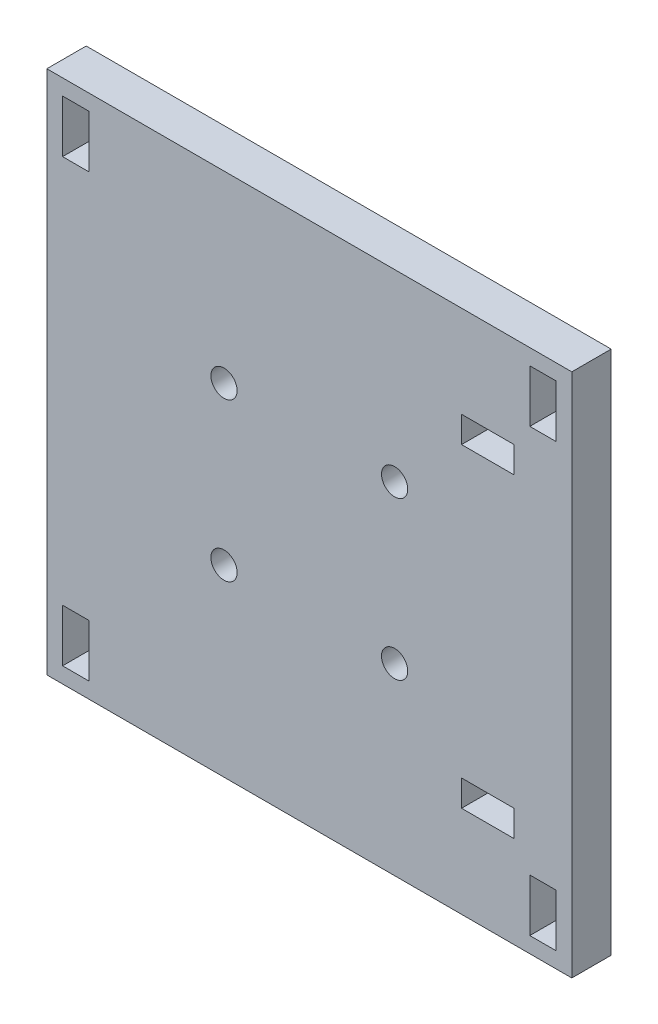
ISO-10303-21;
HEADER;
FILE_DESCRIPTION(('STEP AP214'),'2;1');
FILE_NAME('part.step','',(''),(''),'','','');
FILE_SCHEMA(('AUTOMOTIVE_DESIGN { 1 0 10303 214 1 1 1 1 }'));
ENDSEC;
DATA;
#1=APPLICATION_CONTEXT('core data for automotive mechanical design processes');
#2=APPLICATION_PROTOCOL_DEFINITION('international standard','automotive_design',2000,#1);
#3=PRODUCT_CONTEXT('',#1,'mechanical');
#4=PRODUCT('Part','Part','',(#3));
#5=PRODUCT_RELATED_PRODUCT_CATEGORY('part','',(#4));
#6=PRODUCT_DEFINITION_FORMATION('','',#4);
#7=PRODUCT_DEFINITION_CONTEXT('part definition',#1,'design');
#8=PRODUCT_DEFINITION('design','',#6,#7);
#9=PRODUCT_DEFINITION_SHAPE('','',#8);
#10=(LENGTH_UNIT() NAMED_UNIT(*) SI_UNIT(.MILLI.,.METRE.));
#11=(NAMED_UNIT(*) PLANE_ANGLE_UNIT() SI_UNIT($,.RADIAN.));
#12=(NAMED_UNIT(*) SI_UNIT($,.STERADIAN.) SOLID_ANGLE_UNIT());
#13=UNCERTAINTY_MEASURE_WITH_UNIT(LENGTH_MEASURE(1.E-05),#10,'distance_accuracy_value','');
#14=(GEOMETRIC_REPRESENTATION_CONTEXT(3) GLOBAL_UNCERTAINTY_ASSIGNED_CONTEXT((#13)) GLOBAL_UNIT_ASSIGNED_CONTEXT((#10,
#11,#12)) REPRESENTATION_CONTEXT('',''));
#15=CARTESIAN_POINT('',(0.,0.,0.));
#16=DIRECTION('',(0.,0.,1.));
#17=DIRECTION('',(1.,0.,0.));
#18=AXIS2_PLACEMENT_3D('',#15,#16,#17);
#19=CARTESIAN_POINT('',(0.,0.,3.));
#20=DIRECTION('',(0.,0.,-1.));
#21=DIRECTION('',(-1.,0.,0.));
#22=AXIS2_PLACEMENT_3D('',#19,#20,#21);
#23=PLANE('',#22);
#24=DIRECTION('',(-1.,0.,0.));
#25=VECTOR('',#24,1.);
#26=CARTESIAN_POINT('',(18.8,18.8,3.));
#27=LINE('',#26,#25);
#28=CARTESIAN_POINT('',(18.8,18.8,3.));
#29=VERTEX_POINT('',#28);
#30=CARTESIAN_POINT('',(16.8,18.8,3.));
#31=VERTEX_POINT('',#30);
#32=EDGE_CURVE('E279',#29,#31,#27,.T.);
#33=ORIENTED_EDGE('',*,*,#32,.F.);
#34=DIRECTION('',(0.,1.,0.));
#35=VECTOR('',#34,1.);
#36=CARTESIAN_POINT('',(18.8,18.8,3.));
#37=LINE('',#36,#35);
#38=CARTESIAN_POINT('',(18.8,14.8,3.));
#39=VERTEX_POINT('',#38);
#40=EDGE_CURVE('E52',#39,#29,#37,.T.);
#41=ORIENTED_EDGE('',*,*,#40,.F.);
#42=DIRECTION('',(1.,0.,0.));
#43=VECTOR('',#42,1.);
#44=CARTESIAN_POINT('',(18.8,14.8,3.));
#45=LINE('',#44,#43);
#46=CARTESIAN_POINT('',(16.8,14.8,3.));
#47=VERTEX_POINT('',#46);
#48=EDGE_CURVE('E272',#47,#39,#45,.T.);
#49=ORIENTED_EDGE('',*,*,#48,.F.);
#50=DIRECTION('',(0.,-1.,0.));
#51=VECTOR('',#50,1.);
#52=CARTESIAN_POINT('',(16.8,18.8,3.));
#53=LINE('',#52,#51);
#54=EDGE_CURVE('E275',#31,#47,#53,.T.);
#55=ORIENTED_EDGE('',*,*,#54,.F.);
#56=EDGE_LOOP('',(#33,#41,#49,#55));
#57=FACE_BOUND('',#56,.T.);
#58=DIRECTION('',(0.,1.,0.));
#59=VECTOR('',#58,1.);
#60=CARTESIAN_POINT('',(18.8,-18.8,3.));
#61=LINE('',#60,#59);
#62=CARTESIAN_POINT('',(18.8,-18.8,3.));
#63=VERTEX_POINT('',#62);
#64=CARTESIAN_POINT('',(18.8,-14.8,3.));
#65=VERTEX_POINT('',#64);
#66=EDGE_CURVE('E311',#63,#65,#61,.T.);
#67=ORIENTED_EDGE('',*,*,#66,.F.);
#68=DIRECTION('',(1.,0.,0.));
#69=VECTOR('',#68,1.);
#70=CARTESIAN_POINT('',(18.8,-18.8,3.));
#71=LINE('',#70,#69);
#72=CARTESIAN_POINT('',(16.8,-18.8,3.));
#73=VERTEX_POINT('',#72);
#74=EDGE_CURVE('E60',#73,#63,#71,.T.);
#75=ORIENTED_EDGE('',*,*,#74,.F.);
#76=DIRECTION('',(0.,-1.,0.));
#77=VECTOR('',#76,1.);
#78=CARTESIAN_POINT('',(16.8,-18.8,3.));
#79=LINE('',#78,#77);
#80=CARTESIAN_POINT('',(16.8,-14.8,3.));
#81=VERTEX_POINT('',#80);
#82=EDGE_CURVE('E304',#81,#73,#79,.T.);
#83=ORIENTED_EDGE('',*,*,#82,.F.);
#84=DIRECTION('',(-1.,0.,0.));
#85=VECTOR('',#84,1.);
#86=CARTESIAN_POINT('',(18.8,-14.8,3.));
#87=LINE('',#86,#85);
#88=EDGE_CURVE('E307',#65,#81,#87,.T.);
#89=ORIENTED_EDGE('',*,*,#88,.F.);
#90=EDGE_LOOP('',(#67,#75,#83,#89));
#91=FACE_BOUND('',#90,.T.);
#92=DIRECTION('',(1.,0.,0.));
#93=VECTOR('',#92,1.);
#94=CARTESIAN_POINT('',(-18.8,-18.8,3.));
#95=LINE('',#94,#93);
#96=CARTESIAN_POINT('',(-18.8,-18.8,3.));
#97=VERTEX_POINT('',#96);
#98=CARTESIAN_POINT('',(-16.8,-18.8,3.));
#99=VERTEX_POINT('',#98);
#100=EDGE_CURVE('E343',#97,#99,#95,.T.);
#101=ORIENTED_EDGE('',*,*,#100,.F.);
#102=DIRECTION('',(0.,-1.,0.));
#103=VECTOR('',#102,1.);
#104=CARTESIAN_POINT('',(-18.8,-18.8,3.));
#105=LINE('',#104,#103);
#106=CARTESIAN_POINT('',(-18.8,-14.8,3.));
#107=VERTEX_POINT('',#106);
#108=EDGE_CURVE('E303',#107,#97,#105,.T.);
#109=ORIENTED_EDGE('',*,*,#108,.F.);
#110=DIRECTION('',(-1.,0.,0.));
#111=VECTOR('',#110,1.);
#112=CARTESIAN_POINT('',(-18.8,-14.8,3.));
#113=LINE('',#112,#111);
#114=CARTESIAN_POINT('',(-16.8,-14.8,3.));
#115=VERTEX_POINT('',#114);
#116=EDGE_CURVE('E336',#115,#107,#113,.T.);
#117=ORIENTED_EDGE('',*,*,#116,.F.);
#118=DIRECTION('',(0.,1.,0.));
#119=VECTOR('',#118,1.);
#120=CARTESIAN_POINT('',(-16.8,-18.8,3.));
#121=LINE('',#120,#119);
#122=EDGE_CURVE('E339',#99,#115,#121,.T.);
#123=ORIENTED_EDGE('',*,*,#122,.F.);
#124=EDGE_LOOP('',(#101,#109,#117,#123));
#125=FACE_BOUND('',#124,.T.);
#126=DIRECTION('',(1.,0.,0.));
#127=VECTOR('',#126,1.);
#128=CARTESIAN_POINT('',(11.6,11.,3.));
#129=LINE('',#128,#127);
#130=CARTESIAN_POINT('',(11.6,11.,3.));
#131=VERTEX_POINT('',#130);
#132=CARTESIAN_POINT('',(15.6,11.,3.));
#133=VERTEX_POINT('',#132);
#134=EDGE_CURVE('E371',#131,#133,#129,.T.);
#135=ORIENTED_EDGE('',*,*,#134,.F.);
#136=DIRECTION('',(0.,-1.,0.));
#137=VECTOR('',#136,1.);
#138=CARTESIAN_POINT('',(11.6,13.,3.));
#139=LINE('',#138,#137);
#140=CARTESIAN_POINT('',(11.6,13.,3.));
#141=VERTEX_POINT('',#140);
#142=EDGE_CURVE('E335',#141,#131,#139,.T.);
#143=ORIENTED_EDGE('',*,*,#142,.F.);
#144=DIRECTION('',(-1.,0.,0.));
#145=VECTOR('',#144,1.);
#146=CARTESIAN_POINT('',(11.6,13.,3.));
#147=LINE('',#146,#145);
#148=CARTESIAN_POINT('',(15.6,13.,3.));
#149=VERTEX_POINT('',#148);
#150=EDGE_CURVE('E364',#149,#141,#147,.T.);
#151=ORIENTED_EDGE('',*,*,#150,.F.);
#152=DIRECTION('',(0.,1.,0.));
#153=VECTOR('',#152,1.);
#154=CARTESIAN_POINT('',(15.6,13.,3.));
#155=LINE('',#154,#153);
#156=EDGE_CURVE('E367',#133,#149,#155,.T.);
#157=ORIENTED_EDGE('',*,*,#156,.F.);
#158=EDGE_LOOP('',(#135,#143,#151,#157));
#159=FACE_BOUND('',#158,.T.);
#160=DIRECTION('',(0.,1.,0.));
#161=VECTOR('',#160,1.);
#162=CARTESIAN_POINT('',(15.6,-13.,3.));
#163=LINE('',#162,#161);
#164=CARTESIAN_POINT('',(15.6,-13.,3.));
#165=VERTEX_POINT('',#164);
#166=CARTESIAN_POINT('',(15.6,-11.,3.));
#167=VERTEX_POINT('',#166);
#168=EDGE_CURVE('E245',#165,#167,#163,.T.);
#169=ORIENTED_EDGE('',*,*,#168,.F.);
#170=DIRECTION('',(1.,0.,0.));
#171=VECTOR('',#170,1.);
#172=CARTESIAN_POINT('',(11.6,-13.,3.));
#173=LINE('',#172,#171);
#174=CARTESIAN_POINT('',(11.6,-13.,3.));
#175=VERTEX_POINT('',#174);
#176=EDGE_CURVE('E225',#175,#165,#173,.T.);
#177=ORIENTED_EDGE('',*,*,#176,.F.);
#178=DIRECTION('',(0.,-1.,0.));
#179=VECTOR('',#178,1.);
#180=CARTESIAN_POINT('',(11.6,-13.,3.));
#181=LINE('',#180,#179);
#182=CARTESIAN_POINT('',(11.6,-11.,3.));
#183=VERTEX_POINT('',#182);
#184=EDGE_CURVE('E235',#183,#175,#181,.T.);
#185=ORIENTED_EDGE('',*,*,#184,.F.);
#186=DIRECTION('',(-1.,0.,0.));
#187=VECTOR('',#186,1.);
#188=CARTESIAN_POINT('',(11.6,-11.,3.));
#189=LINE('',#188,#187);
#190=EDGE_CURVE('E240',#167,#183,#189,.T.);
#191=ORIENTED_EDGE('',*,*,#190,.F.);
#192=EDGE_LOOP('',(#169,#177,#185,#191));
#193=FACE_BOUND('',#192,.T.);
#194=DIRECTION('',(1.,0.,0.));
#195=VECTOR('',#194,1.);
#196=CARTESIAN_POINT('',(-18.8,14.8,3.));
#197=LINE('',#196,#195);
#198=CARTESIAN_POINT('',(-18.8,14.8,3.));
#199=VERTEX_POINT('',#198);
#200=CARTESIAN_POINT('',(-16.8,14.8,3.));
#201=VERTEX_POINT('',#200);
#202=EDGE_CURVE('E400',#199,#201,#197,.T.);
#203=ORIENTED_EDGE('',*,*,#202,.F.);
#204=DIRECTION('',(0.,-1.,0.));
#205=VECTOR('',#204,1.);
#206=CARTESIAN_POINT('',(-18.8,18.8,3.));
#207=LINE('',#206,#205);
#208=CARTESIAN_POINT('',(-18.8,18.8,3.));
#209=VERTEX_POINT('',#208);
#210=EDGE_CURVE('E283',#209,#199,#207,.T.);
#211=ORIENTED_EDGE('',*,*,#210,.F.);
#212=DIRECTION('',(-1.,0.,0.));
#213=VECTOR('',#212,1.);
#214=CARTESIAN_POINT('',(-18.8,18.8,3.));
#215=LINE('',#214,#213);
#216=CARTESIAN_POINT('',(-16.8,18.8,3.));
#217=VERTEX_POINT('',#216);
#218=EDGE_CURVE('E389',#217,#209,#215,.T.);
#219=ORIENTED_EDGE('',*,*,#218,.F.);
#220=DIRECTION('',(0.,1.,0.));
#221=VECTOR('',#220,1.);
#222=CARTESIAN_POINT('',(-16.8,18.8,3.));
#223=LINE('',#222,#221);
#224=EDGE_CURVE('E403',#201,#217,#223,.T.);
#225=ORIENTED_EDGE('',*,*,#224,.F.);
#226=EDGE_LOOP('',(#203,#211,#219,#225));
#227=FACE_BOUND('',#226,.T.);
#228=DIRECTION('',(0.,1.,0.));
#229=VECTOR('',#228,1.);
#230=CARTESIAN_POINT('',(20.,-20.,3.));
#231=LINE('',#230,#229);
#232=CARTESIAN_POINT('',(20.,-20.,3.));
#233=VERTEX_POINT('',#232);
#234=CARTESIAN_POINT('',(20.,20.,3.));
#235=VERTEX_POINT('',#234);
#236=EDGE_CURVE('E441',#233,#235,#231,.T.);
#237=ORIENTED_EDGE('',*,*,#236,.T.);
#238=DIRECTION('',(-1.,0.,0.));
#239=VECTOR('',#238,1.);
#240=CARTESIAN_POINT('',(-20.,20.,3.));
#241=LINE('',#240,#239);
#242=CARTESIAN_POINT('',(-20.,20.,3.));
#243=VERTEX_POINT('',#242);
#244=EDGE_CURVE('E444',#235,#243,#241,.T.);
#245=ORIENTED_EDGE('',*,*,#244,.T.);
#246=DIRECTION('',(0.,-1.,0.));
#247=VECTOR('',#246,1.);
#248=CARTESIAN_POINT('',(-20.,-20.,3.));
#249=LINE('',#248,#247);
#250=CARTESIAN_POINT('',(-20.,-20.,3.));
#251=VERTEX_POINT('',#250);
#252=EDGE_CURVE('E447',#243,#251,#249,.T.);
#253=ORIENTED_EDGE('',*,*,#252,.T.);
#254=DIRECTION('',(1.,0.,0.));
#255=VECTOR('',#254,1.);
#256=CARTESIAN_POINT('',(-20.,-20.,3.));
#257=LINE('',#256,#255);
#258=EDGE_CURVE('E449',#251,#233,#257,.T.);
#259=ORIENTED_EDGE('',*,*,#258,.T.);
#260=EDGE_LOOP('',(#237,#245,#253,#259));
#261=FACE_BOUND('',#260,.T.);
#262=CARTESIAN_POINT('',(6.5,-6.,3.));
#263=DIRECTION('',(0.,0.,1.));
#264=DIRECTION('',(1.,0.,0.));
#265=AXIS2_PLACEMENT_3D('',#262,#263,#264);
#266=CIRCLE('',#265,1.);
#267=CARTESIAN_POINT('',(7.5,-6.,3.));
#268=VERTEX_POINT('',#267);
#269=EDGE_CURVE('E435',#268,#268,#266,.T.);
#270=ORIENTED_EDGE('',*,*,#269,.F.);
#271=EDGE_LOOP('',(#270));
#272=FACE_BOUND('',#271,.T.);
#273=CARTESIAN_POINT('',(-6.49999999999996,-6.,3.));
#274=DIRECTION('',(0.,0.,1.));
#275=DIRECTION('',(-1.,0.,0.));
#276=AXIS2_PLACEMENT_3D('',#273,#274,#275);
#277=CIRCLE('',#276,1.);
#278=CARTESIAN_POINT('',(-7.49999999999996,-6.,3.));
#279=VERTEX_POINT('',#278);
#280=EDGE_CURVE('E429',#279,#279,#277,.T.);
#281=ORIENTED_EDGE('',*,*,#280,.F.);
#282=EDGE_LOOP('',(#281));
#283=FACE_BOUND('',#282,.T.);
#284=CARTESIAN_POINT('',(6.5,6.,3.));
#285=DIRECTION('',(0.,0.,1.));
#286=DIRECTION('',(-1.,0.,0.));
#287=AXIS2_PLACEMENT_3D('',#284,#285,#286);
#288=CIRCLE('',#287,1.);
#289=CARTESIAN_POINT('',(5.5,6.,3.));
#290=VERTEX_POINT('',#289);
#291=EDGE_CURVE('E423',#290,#290,#288,.T.);
#292=ORIENTED_EDGE('',*,*,#291,.F.);
#293=EDGE_LOOP('',(#292));
#294=FACE_BOUND('',#293,.T.);
#295=CARTESIAN_POINT('',(-6.49999999999996,6.,3.));
#296=DIRECTION('',(0.,0.,1.));
#297=DIRECTION('',(1.,0.,0.));
#298=AXIS2_PLACEMENT_3D('',#295,#296,#297);
#299=CIRCLE('',#298,1.);
#300=CARTESIAN_POINT('',(-5.49999999999996,6.,3.));
#301=VERTEX_POINT('',#300);
#302=EDGE_CURVE('E417',#301,#301,#299,.T.);
#303=ORIENTED_EDGE('',*,*,#302,.F.);
#304=EDGE_LOOP('',(#303));
#305=FACE_BOUND('',#304,.T.);
#306=ADVANCED_FACE('F37',(#57,#91,#125,#159,#193,#227,#261,#272,#283,#294,#305),#23,.F.);
#307=CARTESIAN_POINT('',(0.,0.,0.));
#308=DIRECTION('',(0.,0.,-1.));
#309=DIRECTION('',(-1.,0.,0.));
#310=AXIS2_PLACEMENT_3D('',#307,#308,#309);
#311=PLANE('',#310);
#312=DIRECTION('',(0.,1.,0.));
#313=VECTOR('',#312,1.);
#314=CARTESIAN_POINT('',(18.8,18.8,0.));
#315=LINE('',#314,#313);
#316=CARTESIAN_POINT('',(18.8,14.8,0.));
#317=VERTEX_POINT('',#316);
#318=CARTESIAN_POINT('',(18.8,18.8,0.));
#319=VERTEX_POINT('',#318);
#320=EDGE_CURVE('E276',#317,#319,#315,.T.);
#321=ORIENTED_EDGE('',*,*,#320,.T.);
#322=DIRECTION('',(-1.,0.,0.));
#323=VECTOR('',#322,1.);
#324=CARTESIAN_POINT('',(18.8,18.8,0.));
#325=LINE('',#324,#323);
#326=CARTESIAN_POINT('',(16.8,18.8,0.));
#327=VERTEX_POINT('',#326);
#328=EDGE_CURVE('E289',#319,#327,#325,.T.);
#329=ORIENTED_EDGE('',*,*,#328,.T.);
#330=DIRECTION('',(0.,-1.,0.));
#331=VECTOR('',#330,1.);
#332=CARTESIAN_POINT('',(16.8,18.8,0.));
#333=LINE('',#332,#331);
#334=CARTESIAN_POINT('',(16.8,14.8,0.));
#335=VERTEX_POINT('',#334);
#336=EDGE_CURVE('E286',#327,#335,#333,.T.);
#337=ORIENTED_EDGE('',*,*,#336,.T.);
#338=DIRECTION('',(1.,0.,0.));
#339=VECTOR('',#338,1.);
#340=CARTESIAN_POINT('',(18.8,14.8,0.));
#341=LINE('',#340,#339);
#342=EDGE_CURVE('E265',#335,#317,#341,.T.);
#343=ORIENTED_EDGE('',*,*,#342,.T.);
#344=EDGE_LOOP('',(#321,#329,#337,#343));
#345=FACE_BOUND('',#344,.T.);
#346=DIRECTION('',(1.,0.,0.));
#347=VECTOR('',#346,1.);
#348=CARTESIAN_POINT('',(18.8,-18.8,0.));
#349=LINE('',#348,#347);
#350=CARTESIAN_POINT('',(16.8,-18.8,0.));
#351=VERTEX_POINT('',#350);
#352=CARTESIAN_POINT('',(18.8,-18.8,0.));
#353=VERTEX_POINT('',#352);
#354=EDGE_CURVE('E308',#351,#353,#349,.T.);
#355=ORIENTED_EDGE('',*,*,#354,.T.);
#356=DIRECTION('',(0.,1.,0.));
#357=VECTOR('',#356,1.);
#358=CARTESIAN_POINT('',(18.8,-18.8,0.));
#359=LINE('',#358,#357);
#360=CARTESIAN_POINT('',(18.8,-14.8,0.));
#361=VERTEX_POINT('',#360);
#362=EDGE_CURVE('E320',#353,#361,#359,.T.);
#363=ORIENTED_EDGE('',*,*,#362,.T.);
#364=DIRECTION('',(-1.,0.,0.));
#365=VECTOR('',#364,1.);
#366=CARTESIAN_POINT('',(18.8,-14.8,0.));
#367=LINE('',#366,#365);
#368=CARTESIAN_POINT('',(16.8,-14.8,0.));
#369=VERTEX_POINT('',#368);
#370=EDGE_CURVE('E317',#361,#369,#367,.T.);
#371=ORIENTED_EDGE('',*,*,#370,.T.);
#372=DIRECTION('',(0.,-1.,0.));
#373=VECTOR('',#372,1.);
#374=CARTESIAN_POINT('',(16.8,-18.8,0.));
#375=LINE('',#374,#373);
#376=EDGE_CURVE('E296',#369,#351,#375,.T.);
#377=ORIENTED_EDGE('',*,*,#376,.T.);
#378=EDGE_LOOP('',(#355,#363,#371,#377));
#379=FACE_BOUND('',#378,.T.);
#380=DIRECTION('',(0.,-1.,0.));
#381=VECTOR('',#380,1.);
#382=CARTESIAN_POINT('',(-18.8,-18.8,0.));
#383=LINE('',#382,#381);
#384=CARTESIAN_POINT('',(-18.8,-14.8,0.));
#385=VERTEX_POINT('',#384);
#386=CARTESIAN_POINT('',(-18.8,-18.8,0.));
#387=VERTEX_POINT('',#386);
#388=EDGE_CURVE('E340',#385,#387,#383,.T.);
#389=ORIENTED_EDGE('',*,*,#388,.T.);
#390=DIRECTION('',(1.,0.,0.));
#391=VECTOR('',#390,1.);
#392=CARTESIAN_POINT('',(-18.8,-18.8,0.));
#393=LINE('',#392,#391);
#394=CARTESIAN_POINT('',(-16.8,-18.8,0.));
#395=VERTEX_POINT('',#394);
#396=EDGE_CURVE('E352',#387,#395,#393,.T.);
#397=ORIENTED_EDGE('',*,*,#396,.T.);
#398=DIRECTION('',(0.,1.,0.));
#399=VECTOR('',#398,1.);
#400=CARTESIAN_POINT('',(-16.8,-18.8,0.));
#401=LINE('',#400,#399);
#402=CARTESIAN_POINT('',(-16.8,-14.8,0.));
#403=VERTEX_POINT('',#402);
#404=EDGE_CURVE('E349',#395,#403,#401,.T.);
#405=ORIENTED_EDGE('',*,*,#404,.T.);
#406=DIRECTION('',(-1.,0.,0.));
#407=VECTOR('',#406,1.);
#408=CARTESIAN_POINT('',(-18.8,-14.8,0.));
#409=LINE('',#408,#407);
#410=EDGE_CURVE('E328',#403,#385,#409,.T.);
#411=ORIENTED_EDGE('',*,*,#410,.T.);
#412=EDGE_LOOP('',(#389,#397,#405,#411));
#413=FACE_BOUND('',#412,.T.);
#414=DIRECTION('',(0.,-1.,0.));
#415=VECTOR('',#414,1.);
#416=CARTESIAN_POINT('',(11.6,13.,0.));
#417=LINE('',#416,#415);
#418=CARTESIAN_POINT('',(11.6,13.,0.));
#419=VERTEX_POINT('',#418);
#420=CARTESIAN_POINT('',(11.6,11.,0.));
#421=VERTEX_POINT('',#420);
#422=EDGE_CURVE('E368',#419,#421,#417,.T.);
#423=ORIENTED_EDGE('',*,*,#422,.T.);
#424=DIRECTION('',(1.,0.,0.));
#425=VECTOR('',#424,1.);
#426=CARTESIAN_POINT('',(11.6,11.,0.));
#427=LINE('',#426,#425);
#428=CARTESIAN_POINT('',(15.6,11.,0.));
#429=VERTEX_POINT('',#428);
#430=EDGE_CURVE('E380',#421,#429,#427,.T.);
#431=ORIENTED_EDGE('',*,*,#430,.T.);
#432=DIRECTION('',(0.,1.,0.));
#433=VECTOR('',#432,1.);
#434=CARTESIAN_POINT('',(15.6,13.,0.));
#435=LINE('',#434,#433);
#436=CARTESIAN_POINT('',(15.6,13.,0.));
#437=VERTEX_POINT('',#436);
#438=EDGE_CURVE('E377',#429,#437,#435,.T.);
#439=ORIENTED_EDGE('',*,*,#438,.T.);
#440=DIRECTION('',(-1.,0.,0.));
#441=VECTOR('',#440,1.);
#442=CARTESIAN_POINT('',(11.6,13.,0.));
#443=LINE('',#442,#441);
#444=EDGE_CURVE('E360',#437,#419,#443,.T.);
#445=ORIENTED_EDGE('',*,*,#444,.T.);
#446=EDGE_LOOP('',(#423,#431,#439,#445));
#447=FACE_BOUND('',#446,.T.);
#448=DIRECTION('',(1.,0.,0.));
#449=VECTOR('',#448,1.);
#450=CARTESIAN_POINT('',(11.6,-13.,0.));
#451=LINE('',#450,#449);
#452=CARTESIAN_POINT('',(11.6,-13.,0.));
#453=VERTEX_POINT('',#452);
#454=CARTESIAN_POINT('',(15.6,-13.,0.));
#455=VERTEX_POINT('',#454);
#456=EDGE_CURVE('E228',#453,#455,#451,.T.);
#457=ORIENTED_EDGE('',*,*,#456,.T.);
#458=DIRECTION('',(0.,1.,0.));
#459=VECTOR('',#458,1.);
#460=CARTESIAN_POINT('',(15.6,-13.,0.));
#461=LINE('',#460,#459);
#462=CARTESIAN_POINT('',(15.6,-11.,0.));
#463=VERTEX_POINT('',#462);
#464=EDGE_CURVE('E259',#455,#463,#461,.T.);
#465=ORIENTED_EDGE('',*,*,#464,.T.);
#466=DIRECTION('',(-1.,0.,0.));
#467=VECTOR('',#466,1.);
#468=CARTESIAN_POINT('',(11.6,-11.,0.));
#469=LINE('',#468,#467);
#470=CARTESIAN_POINT('',(11.6,-11.,0.));
#471=VERTEX_POINT('',#470);
#472=EDGE_CURVE('E255',#463,#471,#469,.T.);
#473=ORIENTED_EDGE('',*,*,#472,.T.);
#474=DIRECTION('',(0.,-1.,0.));
#475=VECTOR('',#474,1.);
#476=CARTESIAN_POINT('',(11.6,-13.,0.));
#477=LINE('',#476,#475);
#478=EDGE_CURVE('E253',#471,#453,#477,.T.);
#479=ORIENTED_EDGE('',*,*,#478,.T.);
#480=EDGE_LOOP('',(#457,#465,#473,#479));
#481=FACE_BOUND('',#480,.T.);
#482=DIRECTION('',(0.,-1.,0.));
#483=VECTOR('',#482,1.);
#484=CARTESIAN_POINT('',(-18.8,18.8,0.));
#485=LINE('',#484,#483);
#486=CARTESIAN_POINT('',(-18.8,18.8,0.));
#487=VERTEX_POINT('',#486);
#488=CARTESIAN_POINT('',(-18.8,14.8,0.));
#489=VERTEX_POINT('',#488);
#490=EDGE_CURVE('E385',#487,#489,#485,.T.);
#491=ORIENTED_EDGE('',*,*,#490,.T.);
#492=DIRECTION('',(1.,0.,0.));
#493=VECTOR('',#492,1.);
#494=CARTESIAN_POINT('',(-18.8,14.8,0.));
#495=LINE('',#494,#493);
#496=CARTESIAN_POINT('',(-16.8,14.8,0.));
#497=VERTEX_POINT('',#496);
#498=EDGE_CURVE('E388',#489,#497,#495,.T.);
#499=ORIENTED_EDGE('',*,*,#498,.T.);
#500=DIRECTION('',(0.,1.,0.));
#501=VECTOR('',#500,1.);
#502=CARTESIAN_POINT('',(-16.8,18.8,0.));
#503=LINE('',#502,#501);
#504=CARTESIAN_POINT('',(-16.8,18.8,0.));
#505=VERTEX_POINT('',#504);
#506=EDGE_CURVE('E392',#497,#505,#503,.T.);
#507=ORIENTED_EDGE('',*,*,#506,.T.);
#508=DIRECTION('',(-1.,0.,0.));
#509=VECTOR('',#508,1.);
#510=CARTESIAN_POINT('',(-18.8,18.8,0.));
#511=LINE('',#510,#509);
#512=EDGE_CURVE('E395',#505,#487,#511,.T.);
#513=ORIENTED_EDGE('',*,*,#512,.T.);
#514=EDGE_LOOP('',(#491,#499,#507,#513));
#515=FACE_BOUND('',#514,.T.);
#516=CARTESIAN_POINT('',(6.5,6.,0.));
#517=DIRECTION('',(0.,0.,1.));
#518=DIRECTION('',(-1.,0.,0.));
#519=AXIS2_PLACEMENT_3D('',#516,#517,#518);
#520=CIRCLE('',#519,1.);
#521=CARTESIAN_POINT('',(5.5,6.,0.));
#522=VERTEX_POINT('',#521);
#523=EDGE_CURVE('E420',#522,#522,#520,.T.);
#524=ORIENTED_EDGE('',*,*,#523,.T.);
#525=EDGE_LOOP('',(#524));
#526=FACE_BOUND('',#525,.T.);
#527=CARTESIAN_POINT('',(6.5,-6.,0.));
#528=DIRECTION('',(0.,0.,1.));
#529=DIRECTION('',(1.,0.,0.));
#530=AXIS2_PLACEMENT_3D('',#527,#528,#529);
#531=CIRCLE('',#530,1.);
#532=CARTESIAN_POINT('',(7.5,-6.,0.));
#533=VERTEX_POINT('',#532);
#534=EDGE_CURVE('E432',#533,#533,#531,.T.);
#535=ORIENTED_EDGE('',*,*,#534,.T.);
#536=EDGE_LOOP('',(#535));
#537=FACE_BOUND('',#536,.T.);
#538=DIRECTION('',(0.,1.,0.));
#539=VECTOR('',#538,1.);
#540=CARTESIAN_POINT('',(20.,-20.,0.));
#541=LINE('',#540,#539);
#542=CARTESIAN_POINT('',(20.,-20.,0.));
#543=VERTEX_POINT('',#542);
#544=CARTESIAN_POINT('',(20.,20.,0.));
#545=VERTEX_POINT('',#544);
#546=EDGE_CURVE('E438',#543,#545,#541,.T.);
#547=ORIENTED_EDGE('',*,*,#546,.F.);
#548=DIRECTION('',(1.,0.,0.));
#549=VECTOR('',#548,1.);
#550=CARTESIAN_POINT('',(-20.,-20.,0.));
#551=LINE('',#550,#549);
#552=CARTESIAN_POINT('',(-20.,-20.,0.));
#553=VERTEX_POINT('',#552);
#554=EDGE_CURVE('E445',#553,#543,#551,.T.);
#555=ORIENTED_EDGE('',*,*,#554,.F.);
#556=DIRECTION('',(0.,-1.,0.));
#557=VECTOR('',#556,1.);
#558=CARTESIAN_POINT('',(-20.,-20.,0.));
#559=LINE('',#558,#557);
#560=CARTESIAN_POINT('',(-20.,20.,0.));
#561=VERTEX_POINT('',#560);
#562=EDGE_CURVE('E456',#561,#553,#559,.T.);
#563=ORIENTED_EDGE('',*,*,#562,.F.);
#564=DIRECTION('',(-1.,0.,0.));
#565=VECTOR('',#564,1.);
#566=CARTESIAN_POINT('',(-20.,20.,0.));
#567=LINE('',#566,#565);
#568=EDGE_CURVE('E454',#545,#561,#567,.T.);
#569=ORIENTED_EDGE('',*,*,#568,.F.);
#570=EDGE_LOOP('',(#547,#555,#563,#569));
#571=FACE_BOUND('',#570,.T.);
#572=CARTESIAN_POINT('',(-6.49999999999996,-6.,0.));
#573=DIRECTION('',(0.,0.,1.));
#574=DIRECTION('',(-1.,0.,0.));
#575=AXIS2_PLACEMENT_3D('',#572,#573,#574);
#576=CIRCLE('',#575,1.);
#577=CARTESIAN_POINT('',(-7.49999999999996,-6.,0.));
#578=VERTEX_POINT('',#577);
#579=EDGE_CURVE('E426',#578,#578,#576,.T.);
#580=ORIENTED_EDGE('',*,*,#579,.T.);
#581=EDGE_LOOP('',(#580));
#582=FACE_BOUND('',#581,.T.);
#583=CARTESIAN_POINT('',(-6.49999999999996,6.,0.));
#584=DIRECTION('',(0.,0.,1.));
#585=DIRECTION('',(1.,0.,0.));
#586=AXIS2_PLACEMENT_3D('',#583,#584,#585);
#587=CIRCLE('',#586,1.);
#588=CARTESIAN_POINT('',(-5.49999999999996,6.,0.));
#589=VERTEX_POINT('',#588);
#590=EDGE_CURVE('E410',#589,#589,#587,.T.);
#591=ORIENTED_EDGE('',*,*,#590,.T.);
#592=EDGE_LOOP('',(#591));
#593=FACE_BOUND('',#592,.T.);
#594=ADVANCED_FACE('F474',(#345,#379,#413,#447,#481,#515,#526,#537,#571,#582,#593),#311,.T.);
#595=CARTESIAN_POINT('',(20.,-20.,3.));
#596=DIRECTION('',(-1.,0.,0.));
#597=DIRECTION('',(0.,0.,1.));
#598=AXIS2_PLACEMENT_3D('',#595,#596,#597);
#599=PLANE('',#598);
#600=ORIENTED_EDGE('',*,*,#546,.T.);
#601=DIRECTION('',(0.,0.,-1.));
#602=VECTOR('',#601,1.);
#603=CARTESIAN_POINT('',(20.,20.,3.));
#604=LINE('',#603,#602);
#605=EDGE_CURVE('E11',#235,#545,#604,.T.);
#606=ORIENTED_EDGE('',*,*,#605,.F.);
#607=ORIENTED_EDGE('',*,*,#236,.F.);
#608=DIRECTION('',(0.,0.,-1.));
#609=VECTOR('',#608,1.);
#610=CARTESIAN_POINT('',(20.,-20.,3.));
#611=LINE('',#610,#609);
#612=EDGE_CURVE('E451',#233,#543,#611,.T.);
#613=ORIENTED_EDGE('',*,*,#612,.T.);
#614=EDGE_LOOP('',(#600,#606,#607,#613));
#615=FACE_BOUND('',#614,.T.);
#616=ADVANCED_FACE('F39',(#615),#599,.F.);
#617=CARTESIAN_POINT('',(-20.,20.,3.));
#618=DIRECTION('',(0.,-1.,0.));
#619=DIRECTION('',(0.,0.,-1.));
#620=AXIS2_PLACEMENT_3D('',#617,#618,#619);
#621=PLANE('',#620);
#622=ORIENTED_EDGE('',*,*,#568,.T.);
#623=DIRECTION('',(0.,0.,-1.));
#624=VECTOR('',#623,1.);
#625=CARTESIAN_POINT('',(-20.,20.,3.));
#626=LINE('',#625,#624);
#627=EDGE_CURVE('E45',#243,#561,#626,.T.);
#628=ORIENTED_EDGE('',*,*,#627,.F.);
#629=ORIENTED_EDGE('',*,*,#244,.F.);
#630=ORIENTED_EDGE('',*,*,#605,.T.);
#631=EDGE_LOOP('',(#622,#628,#629,#630));
#632=FACE_BOUND('',#631,.T.);
#633=ADVANCED_FACE('F485',(#632),#621,.F.);
#634=CARTESIAN_POINT('',(-20.,-20.,3.));
#635=DIRECTION('',(1.,0.,0.));
#636=DIRECTION('',(0.,0.,-1.));
#637=AXIS2_PLACEMENT_3D('',#634,#635,#636);
#638=PLANE('',#637);
#639=ORIENTED_EDGE('',*,*,#562,.T.);
#640=DIRECTION('',(0.,0.,-1.));
#641=VECTOR('',#640,1.);
#642=CARTESIAN_POINT('',(-20.,-20.,3.));
#643=LINE('',#642,#641);
#644=EDGE_CURVE('E461',#251,#553,#643,.T.);
#645=ORIENTED_EDGE('',*,*,#644,.F.);
#646=ORIENTED_EDGE('',*,*,#252,.F.);
#647=ORIENTED_EDGE('',*,*,#627,.T.);
#648=EDGE_LOOP('',(#639,#645,#646,#647));
#649=FACE_BOUND('',#648,.T.);
#650=ADVANCED_FACE('F468',(#649),#638,.F.);
#651=CARTESIAN_POINT('',(-20.,-20.,3.));
#652=DIRECTION('',(0.,1.,0.));
#653=DIRECTION('',(0.,0.,1.));
#654=AXIS2_PLACEMENT_3D('',#651,#652,#653);
#655=PLANE('',#654);
#656=ORIENTED_EDGE('',*,*,#554,.T.);
#657=ORIENTED_EDGE('',*,*,#612,.F.);
#658=ORIENTED_EDGE('',*,*,#258,.F.);
#659=ORIENTED_EDGE('',*,*,#644,.T.);
#660=EDGE_LOOP('',(#656,#657,#658,#659));
#661=FACE_BOUND('',#660,.T.);
#662=ADVANCED_FACE('F478',(#661),#655,.F.);
#663=CARTESIAN_POINT('',(6.5,-6.,3.));
#664=DIRECTION('',(0.,0.,-1.));
#665=DIRECTION('',(-1.,0.,0.));
#666=AXIS2_PLACEMENT_3D('',#663,#664,#665);
#667=CYLINDRICAL_SURFACE('',#666,1.);
#668=ORIENTED_EDGE('',*,*,#269,.T.);
#669=EDGE_LOOP('',(#668));
#670=FACE_BOUND('',#669,.T.);
#671=ORIENTED_EDGE('',*,*,#534,.F.);
#672=EDGE_LOOP('',(#671));
#673=FACE_BOUND('',#672,.T.);
#674=ADVANCED_FACE('F504',(#670,#673),#667,.F.);
#675=CARTESIAN_POINT('',(-6.49999999999996,-6.,3.));
#676=DIRECTION('',(0.,0.,-1.));
#677=DIRECTION('',(-1.,0.,0.));
#678=AXIS2_PLACEMENT_3D('',#675,#676,#677);
#679=CYLINDRICAL_SURFACE('',#678,1.);
#680=ORIENTED_EDGE('',*,*,#280,.T.);
#681=EDGE_LOOP('',(#680));
#682=FACE_BOUND('',#681,.T.);
#683=ORIENTED_EDGE('',*,*,#579,.F.);
#684=EDGE_LOOP('',(#683));
#685=FACE_BOUND('',#684,.T.);
#686=ADVANCED_FACE('F511',(#682,#685),#679,.F.);
#687=CARTESIAN_POINT('',(6.5,6.,3.));
#688=DIRECTION('',(0.,0.,-1.));
#689=DIRECTION('',(-1.,0.,0.));
#690=AXIS2_PLACEMENT_3D('',#687,#688,#689);
#691=CYLINDRICAL_SURFACE('',#690,1.);
#692=ORIENTED_EDGE('',*,*,#291,.T.);
#693=EDGE_LOOP('',(#692));
#694=FACE_BOUND('',#693,.T.);
#695=ORIENTED_EDGE('',*,*,#523,.F.);
#696=EDGE_LOOP('',(#695));
#697=FACE_BOUND('',#696,.T.);
#698=ADVANCED_FACE('F516',(#694,#697),#691,.F.);
#699=CARTESIAN_POINT('',(-6.49999999999996,6.,3.));
#700=DIRECTION('',(0.,0.,-1.));
#701=DIRECTION('',(-1.,0.,0.));
#702=AXIS2_PLACEMENT_3D('',#699,#700,#701);
#703=CYLINDRICAL_SURFACE('',#702,1.);
#704=ORIENTED_EDGE('',*,*,#302,.T.);
#705=EDGE_LOOP('',(#704));
#706=FACE_BOUND('',#705,.T.);
#707=ORIENTED_EDGE('',*,*,#590,.F.);
#708=EDGE_LOOP('',(#707));
#709=FACE_BOUND('',#708,.T.);
#710=ADVANCED_FACE('F529',(#706,#709),#703,.F.);
#711=CARTESIAN_POINT('',(-18.8,18.8,0.));
#712=DIRECTION('',(-1.,0.,0.));
#713=DIRECTION('',(0.,0.,1.));
#714=AXIS2_PLACEMENT_3D('',#711,#712,#713);
#715=PLANE('',#714);
#716=ORIENTED_EDGE('',*,*,#210,.T.);
#717=DIRECTION('',(0.,0.,1.));
#718=VECTOR('',#717,1.);
#719=CARTESIAN_POINT('',(-18.8,14.8,0.));
#720=LINE('',#719,#718);
#721=EDGE_CURVE('E398',#489,#199,#720,.T.);
#722=ORIENTED_EDGE('',*,*,#721,.F.);
#723=ORIENTED_EDGE('',*,*,#490,.F.);
#724=DIRECTION('',(0.,0.,1.));
#725=VECTOR('',#724,1.);
#726=CARTESIAN_POINT('',(-18.8,18.8,0.));
#727=LINE('',#726,#725);
#728=EDGE_CURVE('E408',#487,#209,#727,.T.);
#729=ORIENTED_EDGE('',*,*,#728,.T.);
#730=EDGE_LOOP('',(#716,#722,#723,#729));
#731=FACE_BOUND('',#730,.T.);
#732=ADVANCED_FACE('F532',(#731),#715,.F.);
#733=CARTESIAN_POINT('',(-18.8,18.8,0.));
#734=DIRECTION('',(0.,1.,0.));
#735=DIRECTION('',(0.,0.,1.));
#736=AXIS2_PLACEMENT_3D('',#733,#734,#735);
#737=PLANE('',#736);
#738=ORIENTED_EDGE('',*,*,#218,.T.);
#739=ORIENTED_EDGE('',*,*,#728,.F.);
#740=ORIENTED_EDGE('',*,*,#512,.F.);
#741=DIRECTION('',(0.,0.,1.));
#742=VECTOR('',#741,1.);
#743=CARTESIAN_POINT('',(-16.8,18.8,0.));
#744=LINE('',#743,#742);
#745=EDGE_CURVE('E411',#505,#217,#744,.T.);
#746=ORIENTED_EDGE('',*,*,#745,.T.);
#747=EDGE_LOOP('',(#738,#739,#740,#746));
#748=FACE_BOUND('',#747,.T.);
#749=ADVANCED_FACE('F539',(#748),#737,.F.);
#750=CARTESIAN_POINT('',(-16.8,18.8,0.));
#751=DIRECTION('',(1.,0.,0.));
#752=DIRECTION('',(0.,0.,-1.));
#753=AXIS2_PLACEMENT_3D('',#750,#751,#752);
#754=PLANE('',#753);
#755=ORIENTED_EDGE('',*,*,#224,.T.);
#756=ORIENTED_EDGE('',*,*,#745,.F.);
#757=ORIENTED_EDGE('',*,*,#506,.F.);
#758=DIRECTION('',(0.,0.,1.));
#759=VECTOR('',#758,1.);
#760=CARTESIAN_POINT('',(-16.8,14.8,0.));
#761=LINE('',#760,#759);
#762=EDGE_CURVE('E413',#497,#201,#761,.T.);
#763=ORIENTED_EDGE('',*,*,#762,.T.);
#764=EDGE_LOOP('',(#755,#756,#757,#763));
#765=FACE_BOUND('',#764,.T.);
#766=ADVANCED_FACE('F548',(#765),#754,.F.);
#767=CARTESIAN_POINT('',(-18.8,14.8,0.));
#768=DIRECTION('',(0.,-1.,0.));
#769=DIRECTION('',(1.,0.,0.));
#770=AXIS2_PLACEMENT_3D('',#767,#768,#769);
#771=PLANE('',#770);
#772=ORIENTED_EDGE('',*,*,#202,.T.);
#773=ORIENTED_EDGE('',*,*,#762,.F.);
#774=ORIENTED_EDGE('',*,*,#498,.F.);
#775=ORIENTED_EDGE('',*,*,#721,.T.);
#776=EDGE_LOOP('',(#772,#773,#774,#775));
#777=FACE_BOUND('',#776,.T.);
#778=ADVANCED_FACE('F545',(#777),#771,.F.);
#779=CARTESIAN_POINT('',(11.6,-13.,0.));
#780=DIRECTION('',(0.,-1.,0.));
#781=DIRECTION('',(0.,0.,-1.));
#782=AXIS2_PLACEMENT_3D('',#779,#780,#781);
#783=PLANE('',#782);
#784=ORIENTED_EDGE('',*,*,#176,.T.);
#785=DIRECTION('',(0.,0.,1.));
#786=VECTOR('',#785,1.);
#787=CARTESIAN_POINT('',(15.6,-13.,0.));
#788=LINE('',#787,#786);
#789=EDGE_CURVE('E256',#455,#165,#788,.T.);
#790=ORIENTED_EDGE('',*,*,#789,.F.);
#791=ORIENTED_EDGE('',*,*,#456,.F.);
#792=DIRECTION('',(0.,0.,1.));
#793=VECTOR('',#792,1.);
#794=CARTESIAN_POINT('',(11.6,-13.,0.));
#795=LINE('',#794,#793);
#796=EDGE_CURVE('E221',#453,#175,#795,.T.);
#797=ORIENTED_EDGE('',*,*,#796,.T.);
#798=EDGE_LOOP('',(#784,#790,#791,#797));
#799=FACE_BOUND('',#798,.T.);
#800=ADVANCED_FACE('F223',(#799),#783,.F.);
#801=CARTESIAN_POINT('',(11.6,-13.,0.));
#802=DIRECTION('',(-1.,0.,0.));
#803=DIRECTION('',(0.,0.,1.));
#804=AXIS2_PLACEMENT_3D('',#801,#802,#803);
#805=PLANE('',#804);
#806=ORIENTED_EDGE('',*,*,#184,.T.);
#807=ORIENTED_EDGE('',*,*,#796,.F.);
#808=ORIENTED_EDGE('',*,*,#478,.F.);
#809=DIRECTION('',(0.,0.,1.));
#810=VECTOR('',#809,1.);
#811=CARTESIAN_POINT('',(11.6,-11.,0.));
#812=LINE('',#811,#810);
#813=EDGE_CURVE('E232',#471,#183,#812,.T.);
#814=ORIENTED_EDGE('',*,*,#813,.T.);
#815=EDGE_LOOP('',(#806,#807,#808,#814));
#816=FACE_BOUND('',#815,.T.);
#817=ADVANCED_FACE('F236',(#816),#805,.F.);
#818=CARTESIAN_POINT('',(11.6,-11.,0.));
#819=DIRECTION('',(0.,1.,0.));
#820=DIRECTION('',(0.,0.,1.));
#821=AXIS2_PLACEMENT_3D('',#818,#819,#820);
#822=PLANE('',#821);
#823=ORIENTED_EDGE('',*,*,#190,.T.);
#824=ORIENTED_EDGE('',*,*,#813,.F.);
#825=ORIENTED_EDGE('',*,*,#472,.F.);
#826=DIRECTION('',(0.,0.,1.));
#827=VECTOR('',#826,1.);
#828=CARTESIAN_POINT('',(15.6,-11.,0.));
#829=LINE('',#828,#827);
#830=EDGE_CURVE('E893',#463,#167,#829,.T.);
#831=ORIENTED_EDGE('',*,*,#830,.T.);
#832=EDGE_LOOP('',(#823,#824,#825,#831));
#833=FACE_BOUND('',#832,.T.);
#834=ADVANCED_FACE('F621',(#833),#822,.F.);
#835=CARTESIAN_POINT('',(15.6,-13.,0.));
#836=DIRECTION('',(1.,0.,0.));
#837=DIRECTION('',(0.,0.,-1.));
#838=AXIS2_PLACEMENT_3D('',#835,#836,#837);
#839=PLANE('',#838);
#840=ORIENTED_EDGE('',*,*,#168,.T.);
#841=ORIENTED_EDGE('',*,*,#830,.F.);
#842=ORIENTED_EDGE('',*,*,#464,.F.);
#843=ORIENTED_EDGE('',*,*,#789,.T.);
#844=EDGE_LOOP('',(#840,#841,#842,#843));
#845=FACE_BOUND('',#844,.T.);
#846=ADVANCED_FACE('F572',(#845),#839,.F.);
#847=CARTESIAN_POINT('',(11.6,13.,0.));
#848=DIRECTION('',(-1.,0.,0.));
#849=DIRECTION('',(0.,0.,1.));
#850=AXIS2_PLACEMENT_3D('',#847,#848,#849);
#851=PLANE('',#850);
#852=ORIENTED_EDGE('',*,*,#142,.T.);
#853=DIRECTION('',(0.,0.,1.));
#854=VECTOR('',#853,1.);
#855=CARTESIAN_POINT('',(11.6,11.,0.));
#856=LINE('',#855,#854);
#857=EDGE_CURVE('E357',#421,#131,#856,.T.);
#858=ORIENTED_EDGE('',*,*,#857,.F.);
#859=ORIENTED_EDGE('',*,*,#422,.F.);
#860=DIRECTION('',(0.,0.,1.));
#861=VECTOR('',#860,1.);
#862=CARTESIAN_POINT('',(11.6,13.,0.));
#863=LINE('',#862,#861);
#864=EDGE_CURVE('E246',#419,#141,#863,.T.);
#865=ORIENTED_EDGE('',*,*,#864,.T.);
#866=EDGE_LOOP('',(#852,#858,#859,#865));
#867=FACE_BOUND('',#866,.T.);
#868=ADVANCED_FACE('F560',(#867),#851,.F.);
#869=CARTESIAN_POINT('',(11.6,13.,0.));
#870=DIRECTION('',(0.,1.,0.));
#871=DIRECTION('',(0.,0.,1.));
#872=AXIS2_PLACEMENT_3D('',#869,#870,#871);
#873=PLANE('',#872);
#874=ORIENTED_EDGE('',*,*,#150,.T.);
#875=ORIENTED_EDGE('',*,*,#864,.F.);
#876=ORIENTED_EDGE('',*,*,#444,.F.);
#877=DIRECTION('',(0.,0.,1.));
#878=VECTOR('',#877,1.);
#879=CARTESIAN_POINT('',(15.6,13.,0.));
#880=LINE('',#879,#878);
#881=EDGE_CURVE('E248',#437,#149,#880,.T.);
#882=ORIENTED_EDGE('',*,*,#881,.T.);
#883=EDGE_LOOP('',(#874,#875,#876,#882));
#884=FACE_BOUND('',#883,.T.);
#885=ADVANCED_FACE('F556',(#884),#873,.F.);
#886=CARTESIAN_POINT('',(15.6,13.,0.));
#887=DIRECTION('',(1.,0.,0.));
#888=DIRECTION('',(0.,0.,-1.));
#889=AXIS2_PLACEMENT_3D('',#886,#887,#888);
#890=PLANE('',#889);
#891=ORIENTED_EDGE('',*,*,#156,.T.);
#892=ORIENTED_EDGE('',*,*,#881,.F.);
#893=ORIENTED_EDGE('',*,*,#438,.F.);
#894=DIRECTION('',(0.,0.,1.));
#895=VECTOR('',#894,1.);
#896=CARTESIAN_POINT('',(15.6,11.,0.));
#897=LINE('',#896,#895);
#898=EDGE_CURVE('E361',#429,#133,#897,.T.);
#899=ORIENTED_EDGE('',*,*,#898,.T.);
#900=EDGE_LOOP('',(#891,#892,#893,#899));
#901=FACE_BOUND('',#900,.T.);
#902=ADVANCED_FACE('F559',(#901),#890,.F.);
#903=CARTESIAN_POINT('',(11.6,11.,0.));
#904=DIRECTION('',(0.,-1.,0.));
#905=DIRECTION('',(0.,0.,-1.));
#906=AXIS2_PLACEMENT_3D('',#903,#904,#905);
#907=PLANE('',#906);
#908=ORIENTED_EDGE('',*,*,#134,.T.);
#909=ORIENTED_EDGE('',*,*,#898,.F.);
#910=ORIENTED_EDGE('',*,*,#430,.F.);
#911=ORIENTED_EDGE('',*,*,#857,.T.);
#912=EDGE_LOOP('',(#908,#909,#910,#911));
#913=FACE_BOUND('',#912,.T.);
#914=ADVANCED_FACE('F564',(#913),#907,.F.);
#915=CARTESIAN_POINT('',(-18.8,-18.8,0.));
#916=DIRECTION('',(-1.,0.,0.));
#917=DIRECTION('',(0.,0.,1.));
#918=AXIS2_PLACEMENT_3D('',#915,#916,#917);
#919=PLANE('',#918);
#920=ORIENTED_EDGE('',*,*,#108,.T.);
#921=DIRECTION('',(0.,0.,1.));
#922=VECTOR('',#921,1.);
#923=CARTESIAN_POINT('',(-18.8,-18.8,0.));
#924=LINE('',#923,#922);
#925=EDGE_CURVE('E325',#387,#97,#924,.T.);
#926=ORIENTED_EDGE('',*,*,#925,.F.);
#927=ORIENTED_EDGE('',*,*,#388,.F.);
#928=DIRECTION('',(0.,0.,1.));
#929=VECTOR('',#928,1.);
#930=CARTESIAN_POINT('',(-18.8,-14.8,0.));
#931=LINE('',#930,#929);
#932=EDGE_CURVE('E333',#385,#107,#931,.T.);
#933=ORIENTED_EDGE('',*,*,#932,.T.);
#934=EDGE_LOOP('',(#920,#926,#927,#933));
#935=FACE_BOUND('',#934,.T.);
#936=ADVANCED_FACE('F568',(#935),#919,.F.);
#937=CARTESIAN_POINT('',(-18.8,-14.8,0.));
#938=DIRECTION('',(0.,1.,0.));
#939=DIRECTION('',(-1.,0.,0.));
#940=AXIS2_PLACEMENT_3D('',#937,#938,#939);
#941=PLANE('',#940);
#942=ORIENTED_EDGE('',*,*,#116,.T.);
#943=ORIENTED_EDGE('',*,*,#932,.F.);
#944=ORIENTED_EDGE('',*,*,#410,.F.);
#945=DIRECTION('',(0.,0.,1.));
#946=VECTOR('',#945,1.);
#947=CARTESIAN_POINT('',(-16.8,-14.8,0.));
#948=LINE('',#947,#946);
#949=EDGE_CURVE('E331',#403,#115,#948,.T.);
#950=ORIENTED_EDGE('',*,*,#949,.T.);
#951=EDGE_LOOP('',(#942,#943,#944,#950));
#952=FACE_BOUND('',#951,.T.);
#953=ADVANCED_FACE('F574',(#952),#941,.F.);
#954=CARTESIAN_POINT('',(-16.8,-18.8,0.));
#955=DIRECTION('',(1.,0.,0.));
#956=DIRECTION('',(0.,0.,-1.));
#957=AXIS2_PLACEMENT_3D('',#954,#955,#956);
#958=PLANE('',#957);
#959=ORIENTED_EDGE('',*,*,#122,.T.);
#960=ORIENTED_EDGE('',*,*,#949,.F.);
#961=ORIENTED_EDGE('',*,*,#404,.F.);
#962=DIRECTION('',(0.,0.,1.));
#963=VECTOR('',#962,1.);
#964=CARTESIAN_POINT('',(-16.8,-18.8,0.));
#965=LINE('',#964,#963);
#966=EDGE_CURVE('E329',#395,#99,#965,.T.);
#967=ORIENTED_EDGE('',*,*,#966,.T.);
#968=EDGE_LOOP('',(#959,#960,#961,#967));
#969=FACE_BOUND('',#968,.T.);
#970=ADVANCED_FACE('F577',(#969),#958,.F.);
#971=CARTESIAN_POINT('',(-18.8,-18.8,0.));
#972=DIRECTION('',(0.,-1.,0.));
#973=DIRECTION('',(0.,0.,-1.));
#974=AXIS2_PLACEMENT_3D('',#971,#972,#973);
#975=PLANE('',#974);
#976=ORIENTED_EDGE('',*,*,#100,.T.);
#977=ORIENTED_EDGE('',*,*,#966,.F.);
#978=ORIENTED_EDGE('',*,*,#396,.F.);
#979=ORIENTED_EDGE('',*,*,#925,.T.);
#980=EDGE_LOOP('',(#976,#977,#978,#979));
#981=FACE_BOUND('',#980,.T.);
#982=ADVANCED_FACE('F581',(#981),#975,.F.);
#983=CARTESIAN_POINT('',(18.8,-18.8,0.));
#984=DIRECTION('',(0.,-1.,0.));
#985=DIRECTION('',(0.,0.,-1.));
#986=AXIS2_PLACEMENT_3D('',#983,#984,#985);
#987=PLANE('',#986);
#988=ORIENTED_EDGE('',*,*,#74,.T.);
#989=DIRECTION('',(0.,0.,1.));
#990=VECTOR('',#989,1.);
#991=CARTESIAN_POINT('',(18.8,-18.8,0.));
#992=LINE('',#991,#990);
#993=EDGE_CURVE('E294',#353,#63,#992,.T.);
#994=ORIENTED_EDGE('',*,*,#993,.F.);
#995=ORIENTED_EDGE('',*,*,#354,.F.);
#996=DIRECTION('',(0.,0.,1.));
#997=VECTOR('',#996,1.);
#998=CARTESIAN_POINT('',(16.8,-18.8,0.));
#999=LINE('',#998,#997);
#1000=EDGE_CURVE('E301',#351,#73,#999,.T.);
#1001=ORIENTED_EDGE('',*,*,#1000,.T.);
#1002=EDGE_LOOP('',(#988,#994,#995,#1001));
#1003=FACE_BOUND('',#1002,.T.);
#1004=ADVANCED_FACE('F585',(#1003),#987,.F.);
#1005=CARTESIAN_POINT('',(16.8,-18.8,0.));
#1006=DIRECTION('',(-1.,0.,0.));
#1007=DIRECTION('',(0.,0.,1.));
#1008=AXIS2_PLACEMENT_3D('',#1005,#1006,#1007);
#1009=PLANE('',#1008);
#1010=ORIENTED_EDGE('',*,*,#82,.T.);
#1011=ORIENTED_EDGE('',*,*,#1000,.F.);
#1012=ORIENTED_EDGE('',*,*,#376,.F.);
#1013=DIRECTION('',(0.,0.,1.));
#1014=VECTOR('',#1013,1.);
#1015=CARTESIAN_POINT('',(16.8,-14.8,0.));
#1016=LINE('',#1015,#1014);
#1017=EDGE_CURVE('E299',#369,#81,#1016,.T.);
#1018=ORIENTED_EDGE('',*,*,#1017,.T.);
#1019=EDGE_LOOP('',(#1010,#1011,#1012,#1018));
#1020=FACE_BOUND('',#1019,.T.);
#1021=ADVANCED_FACE('F590',(#1020),#1009,.F.);
#1022=CARTESIAN_POINT('',(18.8,-14.8,0.));
#1023=DIRECTION('',(0.,1.,0.));
#1024=DIRECTION('',(-1.,0.,0.));
#1025=AXIS2_PLACEMENT_3D('',#1022,#1023,#1024);
#1026=PLANE('',#1025);
#1027=ORIENTED_EDGE('',*,*,#88,.T.);
#1028=ORIENTED_EDGE('',*,*,#1017,.F.);
#1029=ORIENTED_EDGE('',*,*,#370,.F.);
#1030=DIRECTION('',(0.,0.,1.));
#1031=VECTOR('',#1030,1.);
#1032=CARTESIAN_POINT('',(18.8,-14.8,0.));
#1033=LINE('',#1032,#1031);
#1034=EDGE_CURVE('E297',#361,#65,#1033,.T.);
#1035=ORIENTED_EDGE('',*,*,#1034,.T.);
#1036=EDGE_LOOP('',(#1027,#1028,#1029,#1035));
#1037=FACE_BOUND('',#1036,.T.);
#1038=ADVANCED_FACE('F593',(#1037),#1026,.F.);
#1039=CARTESIAN_POINT('',(18.8,-18.8,0.));
#1040=DIRECTION('',(1.,0.,0.));
#1041=DIRECTION('',(0.,0.,-1.));
#1042=AXIS2_PLACEMENT_3D('',#1039,#1040,#1041);
#1043=PLANE('',#1042);
#1044=ORIENTED_EDGE('',*,*,#66,.T.);
#1045=ORIENTED_EDGE('',*,*,#1034,.F.);
#1046=ORIENTED_EDGE('',*,*,#362,.F.);
#1047=ORIENTED_EDGE('',*,*,#993,.T.);
#1048=EDGE_LOOP('',(#1044,#1045,#1046,#1047));
#1049=FACE_BOUND('',#1048,.T.);
#1050=ADVANCED_FACE('F597',(#1049),#1043,.F.);
#1051=CARTESIAN_POINT('',(18.8,18.8,0.));
#1052=DIRECTION('',(1.,0.,0.));
#1053=DIRECTION('',(0.,0.,-1.));
#1054=AXIS2_PLACEMENT_3D('',#1051,#1052,#1053);
#1055=PLANE('',#1054);
#1056=ORIENTED_EDGE('',*,*,#40,.T.);
#1057=DIRECTION('',(0.,0.,1.));
#1058=VECTOR('',#1057,1.);
#1059=CARTESIAN_POINT('',(18.8,18.8,0.));
#1060=LINE('',#1059,#1058);
#1061=EDGE_CURVE('E263',#319,#29,#1060,.T.);
#1062=ORIENTED_EDGE('',*,*,#1061,.F.);
#1063=ORIENTED_EDGE('',*,*,#320,.F.);
#1064=DIRECTION('',(0.,0.,1.));
#1065=VECTOR('',#1064,1.);
#1066=CARTESIAN_POINT('',(18.8,14.8,0.));
#1067=LINE('',#1066,#1065);
#1068=EDGE_CURVE('E270',#317,#39,#1067,.T.);
#1069=ORIENTED_EDGE('',*,*,#1068,.T.);
#1070=EDGE_LOOP('',(#1056,#1062,#1063,#1069));
#1071=FACE_BOUND('',#1070,.T.);
#1072=ADVANCED_FACE('F601',(#1071),#1055,.F.);
#1073=CARTESIAN_POINT('',(18.8,14.8,0.));
#1074=DIRECTION('',(0.,-1.,0.));
#1075=DIRECTION('',(1.,0.,0.));
#1076=AXIS2_PLACEMENT_3D('',#1073,#1074,#1075);
#1077=PLANE('',#1076);
#1078=ORIENTED_EDGE('',*,*,#48,.T.);
#1079=ORIENTED_EDGE('',*,*,#1068,.F.);
#1080=ORIENTED_EDGE('',*,*,#342,.F.);
#1081=DIRECTION('',(0.,0.,1.));
#1082=VECTOR('',#1081,1.);
#1083=CARTESIAN_POINT('',(16.8,14.8,0.));
#1084=LINE('',#1083,#1082);
#1085=EDGE_CURVE('E268',#335,#47,#1084,.T.);
#1086=ORIENTED_EDGE('',*,*,#1085,.T.);
#1087=EDGE_LOOP('',(#1078,#1079,#1080,#1086));
#1088=FACE_BOUND('',#1087,.T.);
#1089=ADVANCED_FACE('F605',(#1088),#1077,.F.);
#1090=CARTESIAN_POINT('',(16.8,18.8,0.));
#1091=DIRECTION('',(-1.,0.,0.));
#1092=DIRECTION('',(0.,0.,1.));
#1093=AXIS2_PLACEMENT_3D('',#1090,#1091,#1092);
#1094=PLANE('',#1093);
#1095=ORIENTED_EDGE('',*,*,#54,.T.);
#1096=ORIENTED_EDGE('',*,*,#1085,.F.);
#1097=ORIENTED_EDGE('',*,*,#336,.F.);
#1098=DIRECTION('',(0.,0.,1.));
#1099=VECTOR('',#1098,1.);
#1100=CARTESIAN_POINT('',(16.8,18.8,0.));
#1101=LINE('',#1100,#1099);
#1102=EDGE_CURVE('E266',#327,#31,#1101,.T.);
#1103=ORIENTED_EDGE('',*,*,#1102,.T.);
#1104=EDGE_LOOP('',(#1095,#1096,#1097,#1103));
#1105=FACE_BOUND('',#1104,.T.);
#1106=ADVANCED_FACE('F608',(#1105),#1094,.F.);
#1107=CARTESIAN_POINT('',(18.8,18.8,0.));
#1108=DIRECTION('',(0.,1.,0.));
#1109=DIRECTION('',(0.,0.,1.));
#1110=AXIS2_PLACEMENT_3D('',#1107,#1108,#1109);
#1111=PLANE('',#1110);
#1112=ORIENTED_EDGE('',*,*,#32,.T.);
#1113=ORIENTED_EDGE('',*,*,#1102,.F.);
#1114=ORIENTED_EDGE('',*,*,#328,.F.);
#1115=ORIENTED_EDGE('',*,*,#1061,.T.);
#1116=EDGE_LOOP('',(#1112,#1113,#1114,#1115));
#1117=FACE_BOUND('',#1116,.T.);
#1118=ADVANCED_FACE('F612',(#1117),#1111,.F.);
#1119=CLOSED_SHELL('',(#306,#594,#616,#633,#650,#662,#674,#686,#698,#710,#732,#749,#766,#778,
#800,#817,#834,#846,#868,#885,#902,#914,#936,#953,#970,#982,#1004,#1021,#1038,#1050,#1072,#1089,
#1106,#1118));
#1120=MANIFOLD_SOLID_BREP('B2',#1119);
#1121=ADVANCED_BREP_SHAPE_REPRESENTATION('',(#18,#1120),#14);
#1122=SHAPE_DEFINITION_REPRESENTATION(#9,#1121);
ENDSEC;
END-ISO-10303-21;
